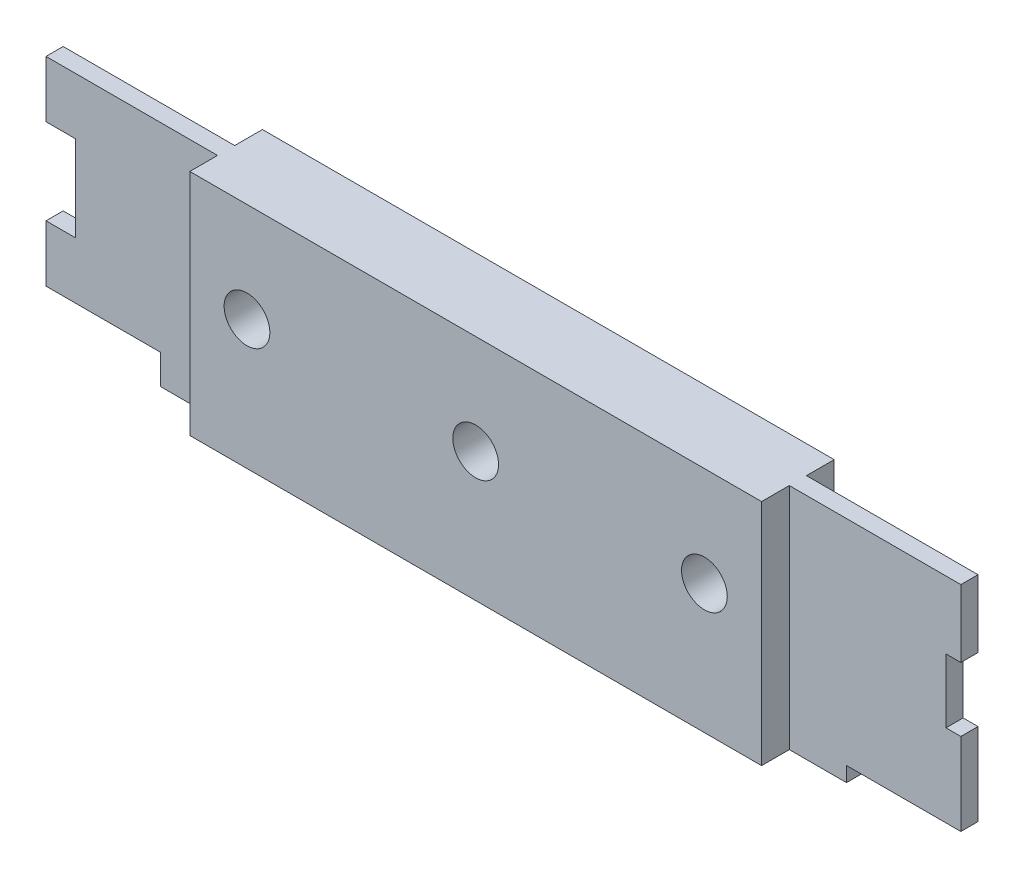
ISO-10303-21;
HEADER;
FILE_DESCRIPTION(('STEP AP214'),'2;1');
FILE_NAME('part.step','',(''),(''),'','','');
FILE_SCHEMA(('AUTOMOTIVE_DESIGN { 1 0 10303 214 1 1 1 1 }'));
ENDSEC;
DATA;
#1=APPLICATION_CONTEXT('core data for automotive mechanical design processes');
#2=APPLICATION_PROTOCOL_DEFINITION('international standard','automotive_design',2000,#1);
#3=PRODUCT_CONTEXT('',#1,'mechanical');
#4=PRODUCT('Part','Part','',(#3));
#5=PRODUCT_RELATED_PRODUCT_CATEGORY('part','',(#4));
#6=PRODUCT_DEFINITION_FORMATION('','',#4);
#7=PRODUCT_DEFINITION_CONTEXT('part definition',#1,'design');
#8=PRODUCT_DEFINITION('design','',#6,#7);
#9=PRODUCT_DEFINITION_SHAPE('','',#8);
#10=(LENGTH_UNIT() NAMED_UNIT(*) SI_UNIT(.MILLI.,.METRE.));
#11=(NAMED_UNIT(*) PLANE_ANGLE_UNIT() SI_UNIT($,.RADIAN.));
#12=(NAMED_UNIT(*) SI_UNIT($,.STERADIAN.) SOLID_ANGLE_UNIT());
#13=UNCERTAINTY_MEASURE_WITH_UNIT(LENGTH_MEASURE(1.E-05),#10,'distance_accuracy_value','');
#14=(GEOMETRIC_REPRESENTATION_CONTEXT(3) GLOBAL_UNCERTAINTY_ASSIGNED_CONTEXT((#13)) GLOBAL_UNIT_ASSIGNED_CONTEXT((#10,
#11,#12)) REPRESENTATION_CONTEXT('',''));
#15=CARTESIAN_POINT('',(0.,0.,0.));
#16=DIRECTION('',(0.,0.,1.));
#17=DIRECTION('',(1.,0.,0.));
#18=AXIS2_PLACEMENT_3D('',#15,#16,#17);
#19=CARTESIAN_POINT('',(0.,0.,0.75));
#20=DIRECTION('',(0.,0.,-1.));
#21=DIRECTION('',(-1.,0.,0.));
#22=AXIS2_PLACEMENT_3D('',#19,#20,#21);
#23=PLANE('',#22);
#24=DIRECTION('',(0.,-1.,0.));
#25=VECTOR('',#24,1.);
#26=CARTESIAN_POINT('',(-25.0000000000001,0.,0.75));
#27=LINE('',#26,#25);
#28=CARTESIAN_POINT('',(-25.0000000000001,8.7,0.75));
#29=VERTEX_POINT('',#28);
#30=CARTESIAN_POINT('',(-25.0000000000001,-11.3,0.75));
#31=VERTEX_POINT('',#30);
#32=EDGE_CURVE('E218',#29,#31,#27,.T.);
#33=ORIENTED_EDGE('',*,*,#32,.F.);
#34=DIRECTION('',(-1.,0.,0.));
#35=VECTOR('',#34,1.);
#36=CARTESIAN_POINT('',(-40.0000000000001,8.7,0.75));
#37=LINE('',#36,#35);
#38=CARTESIAN_POINT('',(-40.0000000000001,8.7,0.75));
#39=VERTEX_POINT('',#38);
#40=EDGE_CURVE('E265',#29,#39,#37,.T.);
#41=ORIENTED_EDGE('',*,*,#40,.T.);
#42=DIRECTION('',(0.,-1.,0.));
#43=VECTOR('',#42,1.);
#44=CARTESIAN_POINT('',(-40.,3.74999999999999,0.75));
#45=LINE('',#44,#43);
#46=CARTESIAN_POINT('',(-40.,3.74999999999999,0.75));
#47=VERTEX_POINT('',#46);
#48=EDGE_CURVE('E233',#39,#47,#45,.T.);
#49=ORIENTED_EDGE('',*,*,#48,.T.);
#50=DIRECTION('',(1.,0.,0.));
#51=VECTOR('',#50,1.);
#52=CARTESIAN_POINT('',(-37.4,3.74999999999999,0.75));
#53=LINE('',#52,#51);
#54=CARTESIAN_POINT('',(-37.4,3.74999999999999,0.75));
#55=VERTEX_POINT('',#54);
#56=EDGE_CURVE('E236',#47,#55,#53,.T.);
#57=ORIENTED_EDGE('',*,*,#56,.T.);
#58=DIRECTION('',(0.,-1.,0.));
#59=VECTOR('',#58,1.);
#60=CARTESIAN_POINT('',(-37.4,-3.75000000000001,0.75));
#61=LINE('',#60,#59);
#62=CARTESIAN_POINT('',(-37.4,-3.75000000000001,0.75));
#63=VERTEX_POINT('',#62);
#64=EDGE_CURVE('E239',#55,#63,#61,.T.);
#65=ORIENTED_EDGE('',*,*,#64,.T.);
#66=DIRECTION('',(-1.,0.,0.));
#67=VECTOR('',#66,1.);
#68=CARTESIAN_POINT('',(-40.,-3.75000000000001,0.75));
#69=LINE('',#68,#67);
#70=CARTESIAN_POINT('',(-40.,-3.75000000000001,0.75));
#71=VERTEX_POINT('',#70);
#72=EDGE_CURVE('E241',#63,#71,#69,.T.);
#73=ORIENTED_EDGE('',*,*,#72,.T.);
#74=DIRECTION('',(0.,-1.,0.));
#75=VECTOR('',#74,1.);
#76=CARTESIAN_POINT('',(-40.,-8.70000000000001,0.75));
#77=LINE('',#76,#75);
#78=CARTESIAN_POINT('',(-40.,-8.70000000000001,0.75));
#79=VERTEX_POINT('',#78);
#80=EDGE_CURVE('E243',#71,#79,#77,.T.);
#81=ORIENTED_EDGE('',*,*,#80,.T.);
#82=DIRECTION('',(1.,0.,0.));
#83=VECTOR('',#82,1.);
#84=CARTESIAN_POINT('',(-30.,-8.70000000000001,0.75));
#85=LINE('',#84,#83);
#86=CARTESIAN_POINT('',(-30.,-8.70000000000001,0.75));
#87=VERTEX_POINT('',#86);
#88=EDGE_CURVE('E245',#79,#87,#85,.T.);
#89=ORIENTED_EDGE('',*,*,#88,.T.);
#90=DIRECTION('',(0.,-1.,0.));
#91=VECTOR('',#90,1.);
#92=CARTESIAN_POINT('',(-30.,-11.3,0.75));
#93=LINE('',#92,#91);
#94=CARTESIAN_POINT('',(-30.,-11.3,0.75));
#95=VERTEX_POINT('',#94);
#96=EDGE_CURVE('E247',#87,#95,#93,.T.);
#97=ORIENTED_EDGE('',*,*,#96,.T.);
#98=DIRECTION('',(1.,0.,0.));
#99=VECTOR('',#98,1.);
#100=CARTESIAN_POINT('',(30.,-11.3,0.75));
#101=LINE('',#100,#99);
#102=EDGE_CURVE('E56',#95,#31,#101,.T.);
#103=ORIENTED_EDGE('',*,*,#102,.T.);
#104=EDGE_LOOP('',(#33,#41,#49,#57,#65,#73,#81,#89,#97,#103));
#105=FACE_BOUND('',#104,.T.);
#106=ADVANCED_FACE('F33',(#105),#23,.F.);
#107=DIRECTION('',(0.,1.,0.));
#108=VECTOR('',#107,1.);
#109=CARTESIAN_POINT('',(25.,0.,0.75));
#110=LINE('',#109,#108);
#111=CARTESIAN_POINT('',(25.,-11.3,0.75));
#112=VERTEX_POINT('',#111);
#113=CARTESIAN_POINT('',(25.,8.7,0.75));
#114=VERTEX_POINT('',#113);
#115=EDGE_CURVE('E48',#112,#114,#110,.T.);
#116=ORIENTED_EDGE('',*,*,#115,.F.);
#117=CARTESIAN_POINT('',(30.,-11.3,0.75));
#118=VERTEX_POINT('',#117);
#119=EDGE_CURVE('E249',#112,#118,#101,.T.);
#120=ORIENTED_EDGE('',*,*,#119,.T.);
#121=DIRECTION('',(0.,1.,0.));
#122=VECTOR('',#121,1.);
#123=CARTESIAN_POINT('',(30.,-9.99999999999999,0.75));
#124=LINE('',#123,#122);
#125=CARTESIAN_POINT('',(30.,-9.99999999999999,0.75));
#126=VERTEX_POINT('',#125);
#127=EDGE_CURVE('E251',#118,#126,#124,.T.);
#128=ORIENTED_EDGE('',*,*,#127,.T.);
#129=DIRECTION('',(1.,0.,0.));
#130=VECTOR('',#129,1.);
#131=CARTESIAN_POINT('',(40.,-9.99999999999999,0.75));
#132=LINE('',#131,#130);
#133=CARTESIAN_POINT('',(40.,-9.99999999999999,0.75));
#134=VERTEX_POINT('',#133);
#135=EDGE_CURVE('E253',#126,#134,#132,.T.);
#136=ORIENTED_EDGE('',*,*,#135,.T.);
#137=DIRECTION('',(0.,1.,0.));
#138=VECTOR('',#137,1.);
#139=CARTESIAN_POINT('',(40.,-2.8,0.75));
#140=LINE('',#139,#138);
#141=CARTESIAN_POINT('',(40.,-2.8,0.75));
#142=VERTEX_POINT('',#141);
#143=EDGE_CURVE('E255',#134,#142,#140,.T.);
#144=ORIENTED_EDGE('',*,*,#143,.T.);
#145=DIRECTION('',(-1.,0.,0.));
#146=VECTOR('',#145,1.);
#147=CARTESIAN_POINT('',(38.7,-2.8,0.75));
#148=LINE('',#147,#146);
#149=CARTESIAN_POINT('',(38.7,-2.8,0.75));
#150=VERTEX_POINT('',#149);
#151=EDGE_CURVE('E257',#142,#150,#148,.T.);
#152=ORIENTED_EDGE('',*,*,#151,.T.);
#153=DIRECTION('',(0.,1.,0.));
#154=VECTOR('',#153,1.);
#155=CARTESIAN_POINT('',(38.7,2.8,0.75));
#156=LINE('',#155,#154);
#157=CARTESIAN_POINT('',(38.7,2.8,0.75));
#158=VERTEX_POINT('',#157);
#159=EDGE_CURVE('E259',#150,#158,#156,.T.);
#160=ORIENTED_EDGE('',*,*,#159,.T.);
#161=DIRECTION('',(1.,0.,0.));
#162=VECTOR('',#161,1.);
#163=CARTESIAN_POINT('',(40.,2.8,0.75));
#164=LINE('',#163,#162);
#165=CARTESIAN_POINT('',(40.,2.8,0.75));
#166=VERTEX_POINT('',#165);
#167=EDGE_CURVE('E261',#158,#166,#164,.T.);
#168=ORIENTED_EDGE('',*,*,#167,.T.);
#169=DIRECTION('',(0.,1.,0.));
#170=VECTOR('',#169,1.);
#171=CARTESIAN_POINT('',(40.0000000000001,8.7,0.75));
#172=LINE('',#171,#170);
#173=CARTESIAN_POINT('',(40.0000000000001,8.7,0.75));
#174=VERTEX_POINT('',#173);
#175=EDGE_CURVE('E263',#166,#174,#172,.T.);
#176=ORIENTED_EDGE('',*,*,#175,.T.);
#177=EDGE_CURVE('E266',#174,#114,#37,.T.);
#178=ORIENTED_EDGE('',*,*,#177,.T.);
#179=EDGE_LOOP('',(#116,#120,#128,#136,#144,#152,#160,#168,#176,#178));
#180=FACE_BOUND('',#179,.T.);
#181=ADVANCED_FACE('F429',(#180),#23,.F.);
#182=CARTESIAN_POINT('',(0.,0.,-0.75));
#183=DIRECTION('',(0.,0.,-1.));
#184=DIRECTION('',(-1.,0.,0.));
#185=AXIS2_PLACEMENT_3D('',#182,#183,#184);
#186=PLANE('',#185);
#187=DIRECTION('',(-1.,0.,0.));
#188=VECTOR('',#187,1.);
#189=CARTESIAN_POINT('',(-40.0000000000001,8.7,-0.75));
#190=LINE('',#189,#188);
#191=CARTESIAN_POINT('',(-25.0000000000001,8.7,-0.75));
#192=VERTEX_POINT('',#191);
#193=CARTESIAN_POINT('',(-40.0000000000001,8.7,-0.75));
#194=VERTEX_POINT('',#193);
#195=EDGE_CURVE('E301',#192,#194,#190,.T.);
#196=ORIENTED_EDGE('',*,*,#195,.F.);
#197=DIRECTION('',(0.,-1.,0.));
#198=VECTOR('',#197,1.);
#199=CARTESIAN_POINT('',(-25.0000000000001,0.,-0.75));
#200=LINE('',#199,#198);
#201=CARTESIAN_POINT('',(-25.0000000000001,-11.3,-0.75));
#202=VERTEX_POINT('',#201);
#203=EDGE_CURVE('E228',#192,#202,#200,.T.);
#204=ORIENTED_EDGE('',*,*,#203,.T.);
#205=DIRECTION('',(1.,0.,0.));
#206=VECTOR('',#205,1.);
#207=CARTESIAN_POINT('',(30.,-11.3,-0.75));
#208=LINE('',#207,#206);
#209=CARTESIAN_POINT('',(-30.,-11.3,-0.75));
#210=VERTEX_POINT('',#209);
#211=EDGE_CURVE('E284',#210,#202,#208,.T.);
#212=ORIENTED_EDGE('',*,*,#211,.F.);
#213=DIRECTION('',(0.,-1.,0.));
#214=VECTOR('',#213,1.);
#215=CARTESIAN_POINT('',(-30.,-11.3,-0.75));
#216=LINE('',#215,#214);
#217=CARTESIAN_POINT('',(-30.,-8.70000000000001,-0.75));
#218=VERTEX_POINT('',#217);
#219=EDGE_CURVE('E281',#218,#210,#216,.T.);
#220=ORIENTED_EDGE('',*,*,#219,.F.);
#221=DIRECTION('',(1.,0.,0.));
#222=VECTOR('',#221,1.);
#223=CARTESIAN_POINT('',(-30.,-8.70000000000001,-0.75));
#224=LINE('',#223,#222);
#225=CARTESIAN_POINT('',(-40.,-8.70000000000001,-0.75));
#226=VERTEX_POINT('',#225);
#227=EDGE_CURVE('E279',#226,#218,#224,.T.);
#228=ORIENTED_EDGE('',*,*,#227,.F.);
#229=DIRECTION('',(0.,-1.,0.));
#230=VECTOR('',#229,1.);
#231=CARTESIAN_POINT('',(-40.,-8.70000000000001,-0.75));
#232=LINE('',#231,#230);
#233=CARTESIAN_POINT('',(-40.,-3.75000000000001,-0.75));
#234=VERTEX_POINT('',#233);
#235=EDGE_CURVE('E277',#234,#226,#232,.T.);
#236=ORIENTED_EDGE('',*,*,#235,.F.);
#237=DIRECTION('',(-1.,0.,0.));
#238=VECTOR('',#237,1.);
#239=CARTESIAN_POINT('',(-40.,-3.75000000000001,-0.75));
#240=LINE('',#239,#238);
#241=CARTESIAN_POINT('',(-37.4,-3.75000000000001,-0.75));
#242=VERTEX_POINT('',#241);
#243=EDGE_CURVE('E275',#242,#234,#240,.T.);
#244=ORIENTED_EDGE('',*,*,#243,.F.);
#245=DIRECTION('',(0.,-1.,0.));
#246=VECTOR('',#245,1.);
#247=CARTESIAN_POINT('',(-37.4,-3.75000000000001,-0.75));
#248=LINE('',#247,#246);
#249=CARTESIAN_POINT('',(-37.4,3.74999999999999,-0.75));
#250=VERTEX_POINT('',#249);
#251=EDGE_CURVE('E273',#250,#242,#248,.T.);
#252=ORIENTED_EDGE('',*,*,#251,.F.);
#253=DIRECTION('',(1.,0.,0.));
#254=VECTOR('',#253,1.);
#255=CARTESIAN_POINT('',(-37.4,3.74999999999999,-0.75));
#256=LINE('',#255,#254);
#257=CARTESIAN_POINT('',(-40.,3.74999999999999,-0.75));
#258=VERTEX_POINT('',#257);
#259=EDGE_CURVE('E271',#258,#250,#256,.T.);
#260=ORIENTED_EDGE('',*,*,#259,.F.);
#261=DIRECTION('',(0.,-1.,0.));
#262=VECTOR('',#261,1.);
#263=CARTESIAN_POINT('',(-40.,3.74999999999999,-0.75));
#264=LINE('',#263,#262);
#265=EDGE_CURVE('E232',#194,#258,#264,.T.);
#266=ORIENTED_EDGE('',*,*,#265,.F.);
#267=EDGE_LOOP('',(#196,#204,#212,#220,#228,#236,#244,#252,#260,#266));
#268=FACE_BOUND('',#267,.T.);
#269=ADVANCED_FACE('F355',(#268),#186,.T.);
#270=CARTESIAN_POINT('',(25.,-11.3,-0.75));
#271=VERTEX_POINT('',#270);
#272=CARTESIAN_POINT('',(30.,-11.3,-0.75));
#273=VERTEX_POINT('',#272);
#274=EDGE_CURVE('E283',#271,#273,#208,.T.);
#275=ORIENTED_EDGE('',*,*,#274,.F.);
#276=DIRECTION('',(0.,1.,0.));
#277=VECTOR('',#276,1.);
#278=CARTESIAN_POINT('',(25.,0.,-0.75));
#279=LINE('',#278,#277);
#280=CARTESIAN_POINT('',(25.,8.7,-0.75));
#281=VERTEX_POINT('',#280);
#282=EDGE_CURVE('E219',#271,#281,#279,.T.);
#283=ORIENTED_EDGE('',*,*,#282,.T.);
#284=CARTESIAN_POINT('',(40.0000000000001,8.7,-0.75));
#285=VERTEX_POINT('',#284);
#286=EDGE_CURVE('E237',#285,#281,#190,.T.);
#287=ORIENTED_EDGE('',*,*,#286,.F.);
#288=DIRECTION('',(0.,1.,0.));
#289=VECTOR('',#288,1.);
#290=CARTESIAN_POINT('',(40.0000000000001,8.7,-0.75));
#291=LINE('',#290,#289);
#292=CARTESIAN_POINT('',(40.,2.8,-0.75));
#293=VERTEX_POINT('',#292);
#294=EDGE_CURVE('E299',#293,#285,#291,.T.);
#295=ORIENTED_EDGE('',*,*,#294,.F.);
#296=DIRECTION('',(1.,0.,0.));
#297=VECTOR('',#296,1.);
#298=CARTESIAN_POINT('',(40.,2.8,-0.75));
#299=LINE('',#298,#297);
#300=CARTESIAN_POINT('',(38.7,2.8,-0.75));
#301=VERTEX_POINT('',#300);
#302=EDGE_CURVE('E297',#301,#293,#299,.T.);
#303=ORIENTED_EDGE('',*,*,#302,.F.);
#304=DIRECTION('',(0.,1.,0.));
#305=VECTOR('',#304,1.);
#306=CARTESIAN_POINT('',(38.7,2.8,-0.75));
#307=LINE('',#306,#305);
#308=CARTESIAN_POINT('',(38.7,-2.8,-0.75));
#309=VERTEX_POINT('',#308);
#310=EDGE_CURVE('E295',#309,#301,#307,.T.);
#311=ORIENTED_EDGE('',*,*,#310,.F.);
#312=DIRECTION('',(-1.,0.,0.));
#313=VECTOR('',#312,1.);
#314=CARTESIAN_POINT('',(38.7,-2.8,-0.75));
#315=LINE('',#314,#313);
#316=CARTESIAN_POINT('',(40.,-2.8,-0.75));
#317=VERTEX_POINT('',#316);
#318=EDGE_CURVE('E293',#317,#309,#315,.T.);
#319=ORIENTED_EDGE('',*,*,#318,.F.);
#320=DIRECTION('',(0.,1.,0.));
#321=VECTOR('',#320,1.);
#322=CARTESIAN_POINT('',(40.,-2.8,-0.75));
#323=LINE('',#322,#321);
#324=CARTESIAN_POINT('',(40.,-9.99999999999999,-0.75));
#325=VERTEX_POINT('',#324);
#326=EDGE_CURVE('E291',#325,#317,#323,.T.);
#327=ORIENTED_EDGE('',*,*,#326,.F.);
#328=DIRECTION('',(1.,0.,0.));
#329=VECTOR('',#328,1.);
#330=CARTESIAN_POINT('',(40.,-9.99999999999999,-0.75));
#331=LINE('',#330,#329);
#332=CARTESIAN_POINT('',(30.,-9.99999999999999,-0.75));
#333=VERTEX_POINT('',#332);
#334=EDGE_CURVE('E289',#333,#325,#331,.T.);
#335=ORIENTED_EDGE('',*,*,#334,.F.);
#336=DIRECTION('',(0.,1.,0.));
#337=VECTOR('',#336,1.);
#338=CARTESIAN_POINT('',(30.,-9.99999999999999,-0.75));
#339=LINE('',#338,#337);
#340=EDGE_CURVE('E287',#273,#333,#339,.T.);
#341=ORIENTED_EDGE('',*,*,#340,.F.);
#342=EDGE_LOOP('',(#275,#283,#287,#295,#303,#311,#319,#327,#335,#341));
#343=FACE_BOUND('',#342,.T.);
#344=ADVANCED_FACE('F417',(#343),#186,.T.);
#345=CARTESIAN_POINT('',(-40.,3.74999999999999,0.75));
#346=DIRECTION('',(1.,0.,0.));
#347=DIRECTION('',(0.,1.,0.));
#348=AXIS2_PLACEMENT_3D('',#345,#346,#347);
#349=PLANE('',#348);
#350=ORIENTED_EDGE('',*,*,#265,.T.);
#351=DIRECTION('',(0.,0.,-1.));
#352=VECTOR('',#351,1.);
#353=CARTESIAN_POINT('',(-40.,3.74999999999999,0.75));
#354=LINE('',#353,#352);
#355=EDGE_CURVE('E11',#47,#258,#354,.T.);
#356=ORIENTED_EDGE('',*,*,#355,.F.);
#357=ORIENTED_EDGE('',*,*,#48,.F.);
#358=DIRECTION('',(0.,0.,-1.));
#359=VECTOR('',#358,1.);
#360=CARTESIAN_POINT('',(-40.0000000000001,8.7,0.75));
#361=LINE('',#360,#359);
#362=EDGE_CURVE('E268',#39,#194,#361,.T.);
#363=ORIENTED_EDGE('',*,*,#362,.T.);
#364=EDGE_LOOP('',(#350,#356,#357,#363));
#365=FACE_BOUND('',#364,.T.);
#366=ADVANCED_FACE('F35',(#365),#349,.F.);
#367=CARTESIAN_POINT('',(-37.4,3.74999999999999,0.75));
#368=DIRECTION('',(0.,1.,0.));
#369=DIRECTION('',(-1.,0.,0.));
#370=AXIS2_PLACEMENT_3D('',#367,#368,#369);
#371=PLANE('',#370);
#372=ORIENTED_EDGE('',*,*,#259,.T.);
#373=DIRECTION('',(0.,0.,-1.));
#374=VECTOR('',#373,1.);
#375=CARTESIAN_POINT('',(-37.4,3.74999999999999,0.75));
#376=LINE('',#375,#374);
#377=EDGE_CURVE('E41',#55,#250,#376,.T.);
#378=ORIENTED_EDGE('',*,*,#377,.F.);
#379=ORIENTED_EDGE('',*,*,#56,.F.);
#380=ORIENTED_EDGE('',*,*,#355,.T.);
#381=EDGE_LOOP('',(#372,#378,#379,#380));
#382=FACE_BOUND('',#381,.T.);
#383=ADVANCED_FACE('F371',(#382),#371,.F.);
#384=CARTESIAN_POINT('',(-37.4,-3.75000000000001,0.75));
#385=DIRECTION('',(1.,0.,0.));
#386=DIRECTION('',(0.,1.,0.));
#387=AXIS2_PLACEMENT_3D('',#384,#385,#386);
#388=PLANE('',#387);
#389=ORIENTED_EDGE('',*,*,#251,.T.);
#390=DIRECTION('',(0.,0.,-1.));
#391=VECTOR('',#390,1.);
#392=CARTESIAN_POINT('',(-37.4,-3.75000000000001,0.75));
#393=LINE('',#392,#391);
#394=EDGE_CURVE('E342',#63,#242,#393,.T.);
#395=ORIENTED_EDGE('',*,*,#394,.F.);
#396=ORIENTED_EDGE('',*,*,#64,.F.);
#397=ORIENTED_EDGE('',*,*,#377,.T.);
#398=EDGE_LOOP('',(#389,#395,#396,#397));
#399=FACE_BOUND('',#398,.T.);
#400=ADVANCED_FACE('F349',(#399),#388,.F.);
#401=CARTESIAN_POINT('',(-40.,-3.75000000000001,0.75));
#402=DIRECTION('',(0.,-1.,0.));
#403=DIRECTION('',(0.,0.,-1.));
#404=AXIS2_PLACEMENT_3D('',#401,#402,#403);
#405=PLANE('',#404);
#406=ORIENTED_EDGE('',*,*,#243,.T.);
#407=DIRECTION('',(0.,0.,-1.));
#408=VECTOR('',#407,1.);
#409=CARTESIAN_POINT('',(-40.,-3.75000000000001,0.75));
#410=LINE('',#409,#408);
#411=EDGE_CURVE('E339',#71,#234,#410,.T.);
#412=ORIENTED_EDGE('',*,*,#411,.F.);
#413=ORIENTED_EDGE('',*,*,#72,.F.);
#414=ORIENTED_EDGE('',*,*,#394,.T.);
#415=EDGE_LOOP('',(#406,#412,#413,#414));
#416=FACE_BOUND('',#415,.T.);
#417=ADVANCED_FACE('F361',(#416),#405,.F.);
#418=CARTESIAN_POINT('',(-40.,-8.70000000000001,0.75));
#419=DIRECTION('',(1.,0.,0.));
#420=DIRECTION('',(0.,1.,0.));
#421=AXIS2_PLACEMENT_3D('',#418,#419,#420);
#422=PLANE('',#421);
#423=ORIENTED_EDGE('',*,*,#235,.T.);
#424=DIRECTION('',(0.,0.,-1.));
#425=VECTOR('',#424,1.);
#426=CARTESIAN_POINT('',(-40.,-8.70000000000001,0.75));
#427=LINE('',#426,#425);
#428=EDGE_CURVE('E336',#79,#226,#427,.T.);
#429=ORIENTED_EDGE('',*,*,#428,.F.);
#430=ORIENTED_EDGE('',*,*,#80,.F.);
#431=ORIENTED_EDGE('',*,*,#411,.T.);
#432=EDGE_LOOP('',(#423,#429,#430,#431));
#433=FACE_BOUND('',#432,.T.);
#434=ADVANCED_FACE('F365',(#433),#422,.F.);
#435=CARTESIAN_POINT('',(-30.,-8.70000000000001,0.75));
#436=DIRECTION('',(0.,1.,0.));
#437=DIRECTION('',(-1.,0.,0.));
#438=AXIS2_PLACEMENT_3D('',#435,#436,#437);
#439=PLANE('',#438);
#440=ORIENTED_EDGE('',*,*,#227,.T.);
#441=DIRECTION('',(0.,0.,-1.));
#442=VECTOR('',#441,1.);
#443=CARTESIAN_POINT('',(-30.,-8.70000000000001,0.75));
#444=LINE('',#443,#442);
#445=EDGE_CURVE('E333',#87,#218,#444,.T.);
#446=ORIENTED_EDGE('',*,*,#445,.F.);
#447=ORIENTED_EDGE('',*,*,#88,.F.);
#448=ORIENTED_EDGE('',*,*,#428,.T.);
#449=EDGE_LOOP('',(#440,#446,#447,#448));
#450=FACE_BOUND('',#449,.T.);
#451=ADVANCED_FACE('F505',(#450),#439,.F.);
#452=CARTESIAN_POINT('',(-30.,-11.3,0.75));
#453=DIRECTION('',(1.,0.,0.));
#454=DIRECTION('',(0.,1.,0.));
#455=AXIS2_PLACEMENT_3D('',#452,#453,#454);
#456=PLANE('',#455);
#457=ORIENTED_EDGE('',*,*,#219,.T.);
#458=DIRECTION('',(0.,0.,-1.));
#459=VECTOR('',#458,1.);
#460=CARTESIAN_POINT('',(-30.,-11.3,0.75));
#461=LINE('',#460,#459);
#462=EDGE_CURVE('E330',#95,#210,#461,.T.);
#463=ORIENTED_EDGE('',*,*,#462,.F.);
#464=ORIENTED_EDGE('',*,*,#96,.F.);
#465=ORIENTED_EDGE('',*,*,#445,.T.);
#466=EDGE_LOOP('',(#457,#463,#464,#465));
#467=FACE_BOUND('',#466,.T.);
#468=ADVANCED_FACE('F502',(#467),#456,.F.);
#469=CARTESIAN_POINT('',(30.,-11.3,0.75));
#470=DIRECTION('',(0.,1.,0.));
#471=DIRECTION('',(-1.,0.,0.));
#472=AXIS2_PLACEMENT_3D('',#469,#470,#471);
#473=PLANE('',#472);
#474=ORIENTED_EDGE('',*,*,#119,.F.);
#475=DIRECTION('',(0.,0.,-1.));
#476=VECTOR('',#475,1.);
#477=CARTESIAN_POINT('',(25.,-11.3,3.175));
#478=LINE('',#477,#476);
#479=CARTESIAN_POINT('',(25.,-11.3,3.175));
#480=VERTEX_POINT('',#479);
#481=EDGE_CURVE('E201',#480,#112,#478,.T.);
#482=ORIENTED_EDGE('',*,*,#481,.F.);
#483=DIRECTION('',(1.,0.,0.));
#484=VECTOR('',#483,1.);
#485=CARTESIAN_POINT('',(-25.0000000000001,-11.3,3.175));
#486=LINE('',#485,#484);
#487=CARTESIAN_POINT('',(-25.0000000000001,-11.3,3.175));
#488=VERTEX_POINT('',#487);
#489=EDGE_CURVE('E195',#488,#480,#486,.T.);
#490=ORIENTED_EDGE('',*,*,#489,.F.);
#491=DIRECTION('',(0.,0.,-1.));
#492=VECTOR('',#491,1.);
#493=CARTESIAN_POINT('',(-25.0000000000001,-11.3,3.175));
#494=LINE('',#493,#492);
#495=EDGE_CURVE('E199',#488,#31,#494,.T.);
#496=ORIENTED_EDGE('',*,*,#495,.T.);
#497=ORIENTED_EDGE('',*,*,#102,.F.);
#498=ORIENTED_EDGE('',*,*,#462,.T.);
#499=ORIENTED_EDGE('',*,*,#211,.T.);
#500=CARTESIAN_POINT('',(-25.0000000000001,-11.3,-3.175));
#501=VERTEX_POINT('',#500);
#502=EDGE_CURVE('E220',#202,#501,#494,.T.);
#503=ORIENTED_EDGE('',*,*,#502,.T.);
#504=DIRECTION('',(1.,0.,0.));
#505=VECTOR('',#504,1.);
#506=CARTESIAN_POINT('',(-25.0000000000001,-11.3,-3.175));
#507=LINE('',#506,#505);
#508=CARTESIAN_POINT('',(25.,-11.3,-3.175));
#509=VERTEX_POINT('',#508);
#510=EDGE_CURVE('E391',#501,#509,#507,.T.);
#511=ORIENTED_EDGE('',*,*,#510,.T.);
#512=EDGE_CURVE('E407',#271,#509,#478,.T.);
#513=ORIENTED_EDGE('',*,*,#512,.F.);
#514=ORIENTED_EDGE('',*,*,#274,.T.);
#515=DIRECTION('',(0.,0.,-1.));
#516=VECTOR('',#515,1.);
#517=CARTESIAN_POINT('',(30.,-11.3,0.75));
#518=LINE('',#517,#516);
#519=EDGE_CURVE('E327',#118,#273,#518,.T.);
#520=ORIENTED_EDGE('',*,*,#519,.F.);
#521=EDGE_LOOP('',(#474,#482,#490,#496,#497,#498,#499,#503,#511,#513,#514,#520));
#522=FACE_BOUND('',#521,.T.);
#523=ADVANCED_FACE('F197',(#522),#473,.F.);
#524=CARTESIAN_POINT('',(30.,-9.99999999999999,0.75));
#525=DIRECTION('',(-1.,0.,0.));
#526=DIRECTION('',(0.,-1.,0.));
#527=AXIS2_PLACEMENT_3D('',#524,#525,#526);
#528=PLANE('',#527);
#529=ORIENTED_EDGE('',*,*,#340,.T.);
#530=DIRECTION('',(0.,0.,-1.));
#531=VECTOR('',#530,1.);
#532=CARTESIAN_POINT('',(30.,-9.99999999999999,0.75));
#533=LINE('',#532,#531);
#534=EDGE_CURVE('E324',#126,#333,#533,.T.);
#535=ORIENTED_EDGE('',*,*,#534,.F.);
#536=ORIENTED_EDGE('',*,*,#127,.F.);
#537=ORIENTED_EDGE('',*,*,#519,.T.);
#538=EDGE_LOOP('',(#529,#535,#536,#537));
#539=FACE_BOUND('',#538,.T.);
#540=ADVANCED_FACE('F422',(#539),#528,.F.);
#541=CARTESIAN_POINT('',(40.,-9.99999999999999,0.75));
#542=DIRECTION('',(0.,1.,0.));
#543=DIRECTION('',(0.,0.,1.));
#544=AXIS2_PLACEMENT_3D('',#541,#542,#543);
#545=PLANE('',#544);
#546=ORIENTED_EDGE('',*,*,#334,.T.);
#547=DIRECTION('',(0.,0.,-1.));
#548=VECTOR('',#547,1.);
#549=CARTESIAN_POINT('',(40.,-9.99999999999999,0.75));
#550=LINE('',#549,#548);
#551=EDGE_CURVE('E321',#134,#325,#550,.T.);
#552=ORIENTED_EDGE('',*,*,#551,.F.);
#553=ORIENTED_EDGE('',*,*,#135,.F.);
#554=ORIENTED_EDGE('',*,*,#534,.T.);
#555=EDGE_LOOP('',(#546,#552,#553,#554));
#556=FACE_BOUND('',#555,.T.);
#557=ADVANCED_FACE('F426',(#556),#545,.F.);
#558=CARTESIAN_POINT('',(40.,-2.8,0.75));
#559=DIRECTION('',(-1.,0.,0.));
#560=DIRECTION('',(0.,-1.,0.));
#561=AXIS2_PLACEMENT_3D('',#558,#559,#560);
#562=PLANE('',#561);
#563=ORIENTED_EDGE('',*,*,#326,.T.);
#564=DIRECTION('',(0.,0.,-1.));
#565=VECTOR('',#564,1.);
#566=CARTESIAN_POINT('',(40.,-2.8,0.75));
#567=LINE('',#566,#565);
#568=EDGE_CURVE('E318',#142,#317,#567,.T.);
#569=ORIENTED_EDGE('',*,*,#568,.F.);
#570=ORIENTED_EDGE('',*,*,#143,.F.);
#571=ORIENTED_EDGE('',*,*,#551,.T.);
#572=EDGE_LOOP('',(#563,#569,#570,#571));
#573=FACE_BOUND('',#572,.T.);
#574=ADVANCED_FACE('F491',(#573),#562,.F.);
#575=CARTESIAN_POINT('',(38.7,-2.8,0.75));
#576=DIRECTION('',(0.,-1.,0.));
#577=DIRECTION('',(0.,0.,-1.));
#578=AXIS2_PLACEMENT_3D('',#575,#576,#577);
#579=PLANE('',#578);
#580=ORIENTED_EDGE('',*,*,#318,.T.);
#581=DIRECTION('',(0.,0.,-1.));
#582=VECTOR('',#581,1.);
#583=CARTESIAN_POINT('',(38.7,-2.8,0.75));
#584=LINE('',#583,#582);
#585=EDGE_CURVE('E315',#150,#309,#584,.T.);
#586=ORIENTED_EDGE('',*,*,#585,.F.);
#587=ORIENTED_EDGE('',*,*,#151,.F.);
#588=ORIENTED_EDGE('',*,*,#568,.T.);
#589=EDGE_LOOP('',(#580,#586,#587,#588));
#590=FACE_BOUND('',#589,.T.);
#591=ADVANCED_FACE('F487',(#590),#579,.F.);
#592=CARTESIAN_POINT('',(38.7,2.8,0.75));
#593=DIRECTION('',(-1.,0.,0.));
#594=DIRECTION('',(0.,0.,1.));
#595=AXIS2_PLACEMENT_3D('',#592,#593,#594);
#596=PLANE('',#595);
#597=ORIENTED_EDGE('',*,*,#310,.T.);
#598=DIRECTION('',(0.,0.,-1.));
#599=VECTOR('',#598,1.);
#600=CARTESIAN_POINT('',(38.7,2.8,0.75));
#601=LINE('',#600,#599);
#602=EDGE_CURVE('E312',#158,#301,#601,.T.);
#603=ORIENTED_EDGE('',*,*,#602,.F.);
#604=ORIENTED_EDGE('',*,*,#159,.F.);
#605=ORIENTED_EDGE('',*,*,#585,.T.);
#606=EDGE_LOOP('',(#597,#603,#604,#605));
#607=FACE_BOUND('',#606,.T.);
#608=ADVANCED_FACE('F483',(#607),#596,.F.);
#609=CARTESIAN_POINT('',(40.,2.8,0.75));
#610=DIRECTION('',(0.,1.,0.));
#611=DIRECTION('',(0.,0.,1.));
#612=AXIS2_PLACEMENT_3D('',#609,#610,#611);
#613=PLANE('',#612);
#614=ORIENTED_EDGE('',*,*,#302,.T.);
#615=DIRECTION('',(0.,0.,-1.));
#616=VECTOR('',#615,1.);
#617=CARTESIAN_POINT('',(40.,2.8,0.75));
#618=LINE('',#617,#616);
#619=EDGE_CURVE('E309',#166,#293,#618,.T.);
#620=ORIENTED_EDGE('',*,*,#619,.F.);
#621=ORIENTED_EDGE('',*,*,#167,.F.);
#622=ORIENTED_EDGE('',*,*,#602,.T.);
#623=EDGE_LOOP('',(#614,#620,#621,#622));
#624=FACE_BOUND('',#623,.T.);
#625=ADVANCED_FACE('F479',(#624),#613,.F.);
#626=CARTESIAN_POINT('',(40.0000000000001,8.7,0.75));
#627=DIRECTION('',(-1.,0.,0.));
#628=DIRECTION('',(0.,-1.,0.));
#629=AXIS2_PLACEMENT_3D('',#626,#627,#628);
#630=PLANE('',#629);
#631=ORIENTED_EDGE('',*,*,#294,.T.);
#632=DIRECTION('',(0.,0.,-1.));
#633=VECTOR('',#632,1.);
#634=CARTESIAN_POINT('',(40.0000000000001,8.7,0.75));
#635=LINE('',#634,#633);
#636=EDGE_CURVE('E306',#174,#285,#635,.T.);
#637=ORIENTED_EDGE('',*,*,#636,.F.);
#638=ORIENTED_EDGE('',*,*,#175,.F.);
#639=ORIENTED_EDGE('',*,*,#619,.T.);
#640=EDGE_LOOP('',(#631,#637,#638,#639));
#641=FACE_BOUND('',#640,.T.);
#642=ADVANCED_FACE('F476',(#641),#630,.F.);
#643=CARTESIAN_POINT('',(-40.0000000000001,8.7,0.75));
#644=DIRECTION('',(0.,-1.,0.));
#645=DIRECTION('',(0.,0.,-1.));
#646=AXIS2_PLACEMENT_3D('',#643,#644,#645);
#647=PLANE('',#646);
#648=ORIENTED_EDGE('',*,*,#286,.T.);
#649=DIRECTION('',(0.,0.,-1.));
#650=VECTOR('',#649,1.);
#651=CARTESIAN_POINT('',(25.,8.7,3.175));
#652=LINE('',#651,#650);
#653=CARTESIAN_POINT('',(25.,8.7,-3.175));
#654=VERTEX_POINT('',#653);
#655=EDGE_CURVE('E404',#281,#654,#652,.T.);
#656=ORIENTED_EDGE('',*,*,#655,.T.);
#657=DIRECTION('',(-1.,0.,0.));
#658=VECTOR('',#657,1.);
#659=CARTESIAN_POINT('',(-25.0000000000001,8.7,-3.175));
#660=LINE('',#659,#658);
#661=CARTESIAN_POINT('',(-25.0000000000001,8.7,-3.175));
#662=VERTEX_POINT('',#661);
#663=EDGE_CURVE('E215',#654,#662,#660,.T.);
#664=ORIENTED_EDGE('',*,*,#663,.T.);
#665=DIRECTION('',(0.,0.,-1.));
#666=VECTOR('',#665,1.);
#667=CARTESIAN_POINT('',(-25.0000000000001,8.7,3.175));
#668=LINE('',#667,#666);
#669=EDGE_CURVE('E379',#192,#662,#668,.T.);
#670=ORIENTED_EDGE('',*,*,#669,.F.);
#671=ORIENTED_EDGE('',*,*,#195,.T.);
#672=ORIENTED_EDGE('',*,*,#362,.F.);
#673=ORIENTED_EDGE('',*,*,#40,.F.);
#674=CARTESIAN_POINT('',(-25.0000000000001,8.7,3.175));
#675=VERTEX_POINT('',#674);
#676=EDGE_CURVE('E384',#675,#29,#668,.T.);
#677=ORIENTED_EDGE('',*,*,#676,.F.);
#678=DIRECTION('',(-1.,0.,0.));
#679=VECTOR('',#678,1.);
#680=CARTESIAN_POINT('',(-25.0000000000001,8.7,3.175));
#681=LINE('',#680,#679);
#682=CARTESIAN_POINT('',(25.,8.7,3.175));
#683=VERTEX_POINT('',#682);
#684=EDGE_CURVE('E211',#683,#675,#681,.T.);
#685=ORIENTED_EDGE('',*,*,#684,.F.);
#686=EDGE_CURVE('E405',#683,#114,#652,.T.);
#687=ORIENTED_EDGE('',*,*,#686,.T.);
#688=ORIENTED_EDGE('',*,*,#177,.F.);
#689=ORIENTED_EDGE('',*,*,#636,.T.);
#690=EDGE_LOOP('',(#648,#656,#664,#670,#671,#672,#673,#677,#685,#687,#688,#689));
#691=FACE_BOUND('',#690,.T.);
#692=ADVANCED_FACE('F377',(#691),#647,.F.);
#693=CARTESIAN_POINT('',(25.,8.7,3.175));
#694=DIRECTION('',(-1.,0.,0.));
#695=DIRECTION('',(0.,0.,1.));
#696=AXIS2_PLACEMENT_3D('',#693,#694,#695);
#697=PLANE('',#696);
#698=ORIENTED_EDGE('',*,*,#282,.F.);
#699=ORIENTED_EDGE('',*,*,#512,.T.);
#700=DIRECTION('',(0.,1.,0.));
#701=VECTOR('',#700,1.);
#702=CARTESIAN_POINT('',(25.,8.7,-3.175));
#703=LINE('',#702,#701);
#704=EDGE_CURVE('E397',#509,#654,#703,.T.);
#705=ORIENTED_EDGE('',*,*,#704,.T.);
#706=ORIENTED_EDGE('',*,*,#655,.F.);
#707=EDGE_LOOP('',(#698,#699,#705,#706));
#708=FACE_BOUND('',#707,.T.);
#709=ADVANCED_FACE('F412',(#708),#697,.F.);
#710=CARTESIAN_POINT('',(-25.0000000000001,8.7,3.175));
#711=DIRECTION('',(1.,0.,0.));
#712=DIRECTION('',(0.,1.,0.));
#713=AXIS2_PLACEMENT_3D('',#710,#711,#712);
#714=PLANE('',#713);
#715=ORIENTED_EDGE('',*,*,#203,.F.);
#716=ORIENTED_EDGE('',*,*,#669,.T.);
#717=DIRECTION('',(0.,-1.,0.));
#718=VECTOR('',#717,1.);
#719=CARTESIAN_POINT('',(-25.0000000000001,8.7,-3.175));
#720=LINE('',#719,#718);
#721=EDGE_CURVE('E387',#662,#501,#720,.T.);
#722=ORIENTED_EDGE('',*,*,#721,.T.);
#723=ORIENTED_EDGE('',*,*,#502,.F.);
#724=EDGE_LOOP('',(#715,#716,#722,#723));
#725=FACE_BOUND('',#724,.T.);
#726=ADVANCED_FACE('F386',(#725),#714,.F.);
#727=CARTESIAN_POINT('',(0.,0.,-3.175));
#728=DIRECTION('',(0.,0.,1.));
#729=DIRECTION('',(1.,0.,0.));
#730=AXIS2_PLACEMENT_3D('',#727,#728,#729);
#731=PLANE('',#730);
#732=ORIENTED_EDGE('',*,*,#721,.F.);
#733=ORIENTED_EDGE('',*,*,#663,.F.);
#734=ORIENTED_EDGE('',*,*,#704,.F.);
#735=ORIENTED_EDGE('',*,*,#510,.F.);
#736=EDGE_LOOP('',(#732,#733,#734,#735));
#737=FACE_BOUND('',#736,.T.);
#738=CARTESIAN_POINT('',(-20.,0.,-3.175));
#739=DIRECTION('',(0.,0.,1.));
#740=DIRECTION('',(1.,0.,0.));
#741=AXIS2_PLACEMENT_3D('',#738,#739,#740);
#742=CIRCLE('',#741,2.00000000000003);
#743=CARTESIAN_POINT('',(-18.,0.,-3.175));
#744=VERTEX_POINT('',#743);
#745=EDGE_CURVE('E435',#744,#744,#742,.T.);
#746=ORIENTED_EDGE('',*,*,#745,.T.);
#747=EDGE_LOOP('',(#746));
#748=FACE_BOUND('',#747,.T.);
#749=CARTESIAN_POINT('',(0.,0.,-3.175));
#750=DIRECTION('',(0.,0.,1.));
#751=DIRECTION('',(1.,0.,0.));
#752=AXIS2_PLACEMENT_3D('',#749,#750,#751);
#753=CIRCLE('',#752,2.);
#754=CARTESIAN_POINT('',(2.,0.,-3.175));
#755=VERTEX_POINT('',#754);
#756=EDGE_CURVE('E441',#755,#755,#753,.T.);
#757=ORIENTED_EDGE('',*,*,#756,.T.);
#758=EDGE_LOOP('',(#757));
#759=FACE_BOUND('',#758,.T.);
#760=CARTESIAN_POINT('',(20.,0.,-3.175));
#761=DIRECTION('',(0.,0.,1.));
#762=DIRECTION('',(1.,0.,0.));
#763=AXIS2_PLACEMENT_3D('',#760,#761,#762);
#764=CIRCLE('',#763,2.00000000000003);
#765=CARTESIAN_POINT('',(22.,0.,-3.175));
#766=VERTEX_POINT('',#765);
#767=EDGE_CURVE('E447',#766,#766,#764,.T.);
#768=ORIENTED_EDGE('',*,*,#767,.T.);
#769=EDGE_LOOP('',(#768));
#770=FACE_BOUND('',#769,.T.);
#771=ADVANCED_FACE('F394',(#737,#748,#759,#770),#731,.F.);
#772=CARTESIAN_POINT('',(20.,0.,0.75));
#773=DIRECTION('',(0.,0.,-1.));
#774=DIRECTION('',(-1.,0.,0.));
#775=AXIS2_PLACEMENT_3D('',#772,#773,#774);
#776=CYLINDRICAL_SURFACE('',#775,2.00000000000003);
#777=ORIENTED_EDGE('',*,*,#767,.F.);
#778=EDGE_LOOP('',(#777));
#779=FACE_BOUND('',#778,.T.);
#780=CARTESIAN_POINT('',(20.,0.,3.175));
#781=DIRECTION('',(0.,0.,1.));
#782=DIRECTION('',(1.,0.,0.));
#783=AXIS2_PLACEMENT_3D('',#780,#781,#782);
#784=CIRCLE('',#783,2.00000000000003);
#785=CARTESIAN_POINT('',(22.,0.,3.175));
#786=VERTEX_POINT('',#785);
#787=EDGE_CURVE('E444',#786,#786,#784,.T.);
#788=ORIENTED_EDGE('',*,*,#787,.T.);
#789=EDGE_LOOP('',(#788));
#790=FACE_BOUND('',#789,.T.);
#791=ADVANCED_FACE('F453',(#779,#790),#776,.F.);
#792=CARTESIAN_POINT('',(0.,0.,0.75));
#793=DIRECTION('',(0.,0.,-1.));
#794=DIRECTION('',(-1.,0.,0.));
#795=AXIS2_PLACEMENT_3D('',#792,#793,#794);
#796=CYLINDRICAL_SURFACE('',#795,2.00000000000002);
#797=ORIENTED_EDGE('',*,*,#756,.F.);
#798=EDGE_LOOP('',(#797));
#799=FACE_BOUND('',#798,.T.);
#800=CARTESIAN_POINT('',(0.,0.,3.175));
#801=DIRECTION('',(0.,0.,1.));
#802=DIRECTION('',(1.,0.,0.));
#803=AXIS2_PLACEMENT_3D('',#800,#801,#802);
#804=CIRCLE('',#803,2.);
#805=CARTESIAN_POINT('',(2.,0.,3.175));
#806=VERTEX_POINT('',#805);
#807=EDGE_CURVE('E438',#806,#806,#804,.T.);
#808=ORIENTED_EDGE('',*,*,#807,.T.);
#809=EDGE_LOOP('',(#808));
#810=FACE_BOUND('',#809,.T.);
#811=ADVANCED_FACE('F661',(#799,#810),#796,.F.);
#812=CARTESIAN_POINT('',(-20.,0.,0.75));
#813=DIRECTION('',(0.,0.,-1.));
#814=DIRECTION('',(-1.,0.,0.));
#815=AXIS2_PLACEMENT_3D('',#812,#813,#814);
#816=CYLINDRICAL_SURFACE('',#815,2.00000000000003);
#817=ORIENTED_EDGE('',*,*,#745,.F.);
#818=EDGE_LOOP('',(#817));
#819=FACE_BOUND('',#818,.T.);
#820=CARTESIAN_POINT('',(-20.,0.,3.175));
#821=DIRECTION('',(0.,0.,1.));
#822=DIRECTION('',(1.,0.,0.));
#823=AXIS2_PLACEMENT_3D('',#820,#821,#822);
#824=CIRCLE('',#823,2.00000000000003);
#825=CARTESIAN_POINT('',(-18.,0.,3.175));
#826=VERTEX_POINT('',#825);
#827=EDGE_CURVE('E400',#826,#826,#824,.T.);
#828=ORIENTED_EDGE('',*,*,#827,.T.);
#829=EDGE_LOOP('',(#828));
#830=FACE_BOUND('',#829,.T.);
#831=ADVANCED_FACE('F671',(#819,#830),#816,.F.);
#832=ORIENTED_EDGE('',*,*,#676,.T.);
#833=ORIENTED_EDGE('',*,*,#32,.T.);
#834=ORIENTED_EDGE('',*,*,#495,.F.);
#835=DIRECTION('',(0.,-1.,0.));
#836=VECTOR('',#835,1.);
#837=CARTESIAN_POINT('',(-25.0000000000001,8.7,3.175));
#838=LINE('',#837,#836);
#839=EDGE_CURVE('E205',#675,#488,#838,.T.);
#840=ORIENTED_EDGE('',*,*,#839,.F.);
#841=EDGE_LOOP('',(#832,#833,#834,#840));
#842=FACE_BOUND('',#841,.T.);
#843=ADVANCED_FACE('F217',(#842),#714,.F.);
#844=ORIENTED_EDGE('',*,*,#481,.T.);
#845=ORIENTED_EDGE('',*,*,#115,.T.);
#846=ORIENTED_EDGE('',*,*,#686,.F.);
#847=DIRECTION('',(0.,1.,0.));
#848=VECTOR('',#847,1.);
#849=CARTESIAN_POINT('',(25.,8.7,3.175));
#850=LINE('',#849,#848);
#851=EDGE_CURVE('E204',#480,#683,#850,.T.);
#852=ORIENTED_EDGE('',*,*,#851,.F.);
#853=EDGE_LOOP('',(#844,#845,#846,#852));
#854=FACE_BOUND('',#853,.T.);
#855=ADVANCED_FACE('F432',(#854),#697,.F.);
#856=CARTESIAN_POINT('',(0.,0.,3.175));
#857=DIRECTION('',(0.,0.,1.));
#858=DIRECTION('',(1.,0.,0.));
#859=AXIS2_PLACEMENT_3D('',#856,#857,#858);
#860=PLANE('',#859);
#861=ORIENTED_EDGE('',*,*,#807,.F.);
#862=EDGE_LOOP('',(#861));
#863=FACE_BOUND('',#862,.T.);
#864=ORIENTED_EDGE('',*,*,#839,.T.);
#865=ORIENTED_EDGE('',*,*,#489,.T.);
#866=ORIENTED_EDGE('',*,*,#851,.T.);
#867=ORIENTED_EDGE('',*,*,#684,.T.);
#868=EDGE_LOOP('',(#864,#865,#866,#867));
#869=FACE_BOUND('',#868,.T.);
#870=ORIENTED_EDGE('',*,*,#827,.F.);
#871=EDGE_LOOP('',(#870));
#872=FACE_BOUND('',#871,.T.);
#873=ORIENTED_EDGE('',*,*,#787,.F.);
#874=EDGE_LOOP('',(#873));
#875=FACE_BOUND('',#874,.T.);
#876=ADVANCED_FACE('F208',(#863,#869,#872,#875),#860,.T.);
#877=CLOSED_SHELL('',(#106,#181,#269,#344,#366,#383,#400,#417,#434,#451,#468,#523,#540,#557,
#574,#591,#608,#625,#642,#692,#709,#726,#771,#791,#811,#831,#843,#855,#876));
#878=MANIFOLD_SOLID_BREP('B2',#877);
#879=ADVANCED_BREP_SHAPE_REPRESENTATION('',(#18,#878),#14);
#880=SHAPE_DEFINITION_REPRESENTATION(#9,#879);
ENDSEC;
END-ISO-10303-21;
